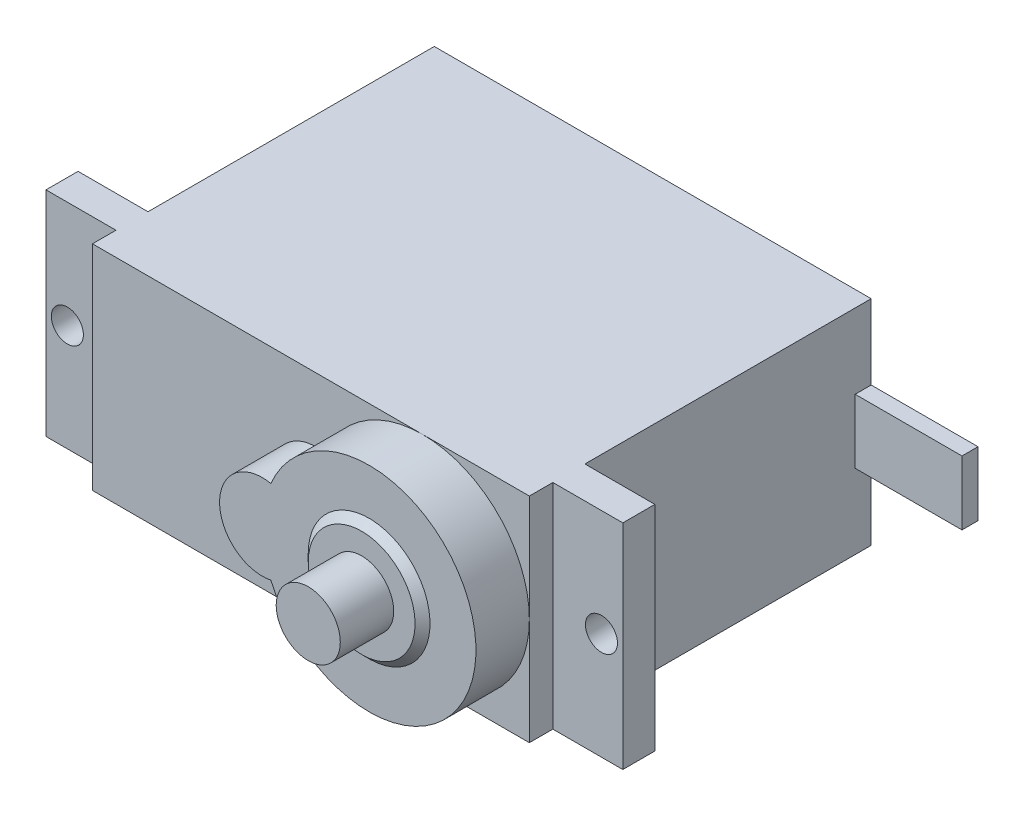
ISO-10303-21;
HEADER;
FILE_DESCRIPTION(('STEP AP214'),'2;1');
FILE_NAME('part.step','',(''),(''),'','','');
FILE_SCHEMA(('AUTOMOTIVE_DESIGN { 1 0 10303 214 1 1 1 1 }'));
ENDSEC;
DATA;
#1=APPLICATION_CONTEXT('core data for automotive mechanical design processes');
#2=APPLICATION_PROTOCOL_DEFINITION('international standard','automotive_design',2000,#1);
#3=PRODUCT_CONTEXT('',#1,'mechanical');
#4=PRODUCT('Part','Part','',(#3));
#5=PRODUCT_RELATED_PRODUCT_CATEGORY('part','',(#4));
#6=PRODUCT_DEFINITION_FORMATION('','',#4);
#7=PRODUCT_DEFINITION_CONTEXT('part definition',#1,'design');
#8=PRODUCT_DEFINITION('design','',#6,#7);
#9=PRODUCT_DEFINITION_SHAPE('','',#8);
#10=(LENGTH_UNIT() NAMED_UNIT(*) SI_UNIT(.MILLI.,.METRE.));
#11=(NAMED_UNIT(*) PLANE_ANGLE_UNIT() SI_UNIT($,.RADIAN.));
#12=(NAMED_UNIT(*) SI_UNIT($,.STERADIAN.) SOLID_ANGLE_UNIT());
#13=UNCERTAINTY_MEASURE_WITH_UNIT(LENGTH_MEASURE(1.E-05),#10,'distance_accuracy_value','');
#14=(GEOMETRIC_REPRESENTATION_CONTEXT(3) GLOBAL_UNCERTAINTY_ASSIGNED_CONTEXT((#13)) GLOBAL_UNIT_ASSIGNED_CONTEXT((#10,
#11,#12)) REPRESENTATION_CONTEXT('',''));
#15=CARTESIAN_POINT('',(0.,0.,0.));
#16=DIRECTION('',(0.,0.,1.));
#17=DIRECTION('',(1.,0.,0.));
#18=AXIS2_PLACEMENT_3D('',#15,#16,#17);
#19=CARTESIAN_POINT('',(10.,10.,-40.2));
#20=DIRECTION('',(-1.,0.,0.));
#21=DIRECTION('',(0.,0.,1.));
#22=AXIS2_PLACEMENT_3D('',#19,#20,#21);
#23=PLANE('',#22);
#24=DIRECTION('',(0.,0.,-1.));
#25=VECTOR('',#24,1.);
#26=CARTESIAN_POINT('',(10.,-3.,-38.7));
#27=LINE('',#26,#25);
#28=CARTESIAN_POINT('',(10.,-3.,-38.7));
#29=VERTEX_POINT('',#28);
#30=CARTESIAN_POINT('',(10.,-3.,-40.2));
#31=VERTEX_POINT('',#30);
#32=EDGE_CURVE('E396',#29,#31,#27,.T.);
#33=ORIENTED_EDGE('',*,*,#32,.F.);
#34=DIRECTION('',(0.,-1.,0.));
#35=VECTOR('',#34,1.);
#36=CARTESIAN_POINT('',(10.,3.,-38.7));
#37=LINE('',#36,#35);
#38=CARTESIAN_POINT('',(10.,3.,-38.7));
#39=VERTEX_POINT('',#38);
#40=EDGE_CURVE('E188',#39,#29,#37,.T.);
#41=ORIENTED_EDGE('',*,*,#40,.F.);
#42=DIRECTION('',(0.,0.,1.));
#43=VECTOR('',#42,1.);
#44=CARTESIAN_POINT('',(10.,3.,-38.7));
#45=LINE('',#44,#43);
#46=CARTESIAN_POINT('',(10.,3.,-40.2));
#47=VERTEX_POINT('',#46);
#48=EDGE_CURVE('E184',#47,#39,#45,.T.);
#49=ORIENTED_EDGE('',*,*,#48,.F.);
#50=DIRECTION('',(0.,-1.,0.));
#51=VECTOR('',#50,1.);
#52=CARTESIAN_POINT('',(10.,10.,-40.2));
#53=LINE('',#52,#51);
#54=CARTESIAN_POINT('',(10.,10.,-40.2));
#55=VERTEX_POINT('',#54);
#56=EDGE_CURVE('E248',#55,#47,#53,.T.);
#57=ORIENTED_EDGE('',*,*,#56,.F.);
#58=DIRECTION('',(0.,0.,1.));
#59=VECTOR('',#58,1.);
#60=CARTESIAN_POINT('',(10.,10.,-40.2));
#61=LINE('',#60,#59);
#62=CARTESIAN_POINT('',(10.,10.,-13.4));
#63=VERTEX_POINT('',#62);
#64=EDGE_CURVE('E273',#55,#63,#61,.T.);
#65=ORIENTED_EDGE('',*,*,#64,.T.);
#66=DIRECTION('',(0.,1.,0.));
#67=VECTOR('',#66,1.);
#68=CARTESIAN_POINT('',(10.,10.,-13.4));
#69=LINE('',#68,#67);
#70=CARTESIAN_POINT('',(10.,-10.,-13.4));
#71=VERTEX_POINT('',#70);
#72=EDGE_CURVE('E236',#71,#63,#69,.T.);
#73=ORIENTED_EDGE('',*,*,#72,.F.);
#74=DIRECTION('',(0.,0.,1.));
#75=VECTOR('',#74,1.);
#76=CARTESIAN_POINT('',(10.,-10.,-40.2));
#77=LINE('',#76,#75);
#78=CARTESIAN_POINT('',(10.,-10.,-40.2));
#79=VERTEX_POINT('',#78);
#80=EDGE_CURVE('E285',#79,#71,#77,.T.);
#81=ORIENTED_EDGE('',*,*,#80,.F.);
#82=EDGE_CURVE('E252',#31,#79,#53,.T.);
#83=ORIENTED_EDGE('',*,*,#82,.F.);
#84=EDGE_LOOP('',(#33,#41,#49,#57,#65,#73,#81,#83));
#85=FACE_BOUND('',#84,.T.);
#86=ADVANCED_FACE('F34',(#85),#23,.F.);
#87=CARTESIAN_POINT('',(10.,-10.,-40.2));
#88=DIRECTION('',(0.,1.,0.));
#89=DIRECTION('',(0.,0.,1.));
#90=AXIS2_PLACEMENT_3D('',#87,#88,#89);
#91=PLANE('',#90);
#92=DIRECTION('',(0.,0.,1.));
#93=VECTOR('',#92,1.);
#94=CARTESIAN_POINT('',(-37.45,-10.,-40.2));
#95=LINE('',#94,#93);
#96=CARTESIAN_POINT('',(-37.45,-10.,-13.4));
#97=VERTEX_POINT('',#96);
#98=CARTESIAN_POINT('',(-37.45,-10.,-10.4));
#99=VERTEX_POINT('',#98);
#100=EDGE_CURVE('E209',#97,#99,#95,.T.);
#101=ORIENTED_EDGE('',*,*,#100,.F.);
#102=DIRECTION('',(1.,0.,0.));
#103=VECTOR('',#102,1.);
#104=CARTESIAN_POINT('',(-50.9,-10.,-13.4));
#105=LINE('',#104,#103);
#106=CARTESIAN_POINT('',(-30.9,-10.,-13.4));
#107=VERTEX_POINT('',#106);
#108=EDGE_CURVE('E227',#97,#107,#105,.T.);
#109=ORIENTED_EDGE('',*,*,#108,.T.);
#110=DIRECTION('',(0.,0.,1.));
#111=VECTOR('',#110,1.);
#112=CARTESIAN_POINT('',(-30.9,-10.,-40.2));
#113=LINE('',#112,#111);
#114=CARTESIAN_POINT('',(-30.9,-10.,-40.2));
#115=VERTEX_POINT('',#114);
#116=EDGE_CURVE('E281',#115,#107,#113,.T.);
#117=ORIENTED_EDGE('',*,*,#116,.F.);
#118=DIRECTION('',(-1.,0.,0.));
#119=VECTOR('',#118,1.);
#120=CARTESIAN_POINT('',(10.,-10.,-40.2));
#121=LINE('',#120,#119);
#122=EDGE_CURVE('E251',#79,#115,#121,.T.);
#123=ORIENTED_EDGE('',*,*,#122,.F.);
#124=ORIENTED_EDGE('',*,*,#80,.T.);
#125=DIRECTION('',(-1.,0.,0.));
#126=VECTOR('',#125,1.);
#127=CARTESIAN_POINT('',(30.,-10.,-13.4));
#128=LINE('',#127,#126);
#129=CARTESIAN_POINT('',(16.55,-10.,-13.4));
#130=VERTEX_POINT('',#129);
#131=EDGE_CURVE('E243',#130,#71,#128,.T.);
#132=ORIENTED_EDGE('',*,*,#131,.F.);
#133=DIRECTION('',(0.,0.,-1.));
#134=VECTOR('',#133,1.);
#135=CARTESIAN_POINT('',(16.55,-10.,-40.2));
#136=LINE('',#135,#134);
#137=CARTESIAN_POINT('',(16.55,-10.,-10.4));
#138=VERTEX_POINT('',#137);
#139=EDGE_CURVE('E57',#138,#130,#136,.T.);
#140=ORIENTED_EDGE('',*,*,#139,.F.);
#141=DIRECTION('',(-1.,0.,0.));
#142=VECTOR('',#141,1.);
#143=CARTESIAN_POINT('',(30.,-10.,-10.4));
#144=LINE('',#143,#142);
#145=CARTESIAN_POINT('',(10.,-10.,-10.4));
#146=VERTEX_POINT('',#145);
#147=EDGE_CURVE('E245',#138,#146,#144,.T.);
#148=ORIENTED_EDGE('',*,*,#147,.T.);
#149=CARTESIAN_POINT('',(10.,-10.,-8.2));
#150=VERTEX_POINT('',#149);
#151=EDGE_CURVE('E284',#146,#150,#77,.T.);
#152=ORIENTED_EDGE('',*,*,#151,.T.);
#153=DIRECTION('',(-1.,0.,0.));
#154=VECTOR('',#153,1.);
#155=CARTESIAN_POINT('',(10.,-10.,-8.2));
#156=LINE('',#155,#154);
#157=CARTESIAN_POINT('',(0.,-10.,-8.2));
#158=VERTEX_POINT('',#157);
#159=EDGE_CURVE('E263',#150,#158,#156,.T.);
#160=ORIENTED_EDGE('',*,*,#159,.T.);
#161=CARTESIAN_POINT('',(-30.9,-10.,-8.2));
#162=VERTEX_POINT('',#161);
#163=EDGE_CURVE('E262',#158,#162,#156,.T.);
#164=ORIENTED_EDGE('',*,*,#163,.T.);
#165=CARTESIAN_POINT('',(-30.9,-10.,-10.4));
#166=VERTEX_POINT('',#165);
#167=EDGE_CURVE('E280',#166,#162,#113,.T.);
#168=ORIENTED_EDGE('',*,*,#167,.F.);
#169=DIRECTION('',(1.,0.,0.));
#170=VECTOR('',#169,1.);
#171=CARTESIAN_POINT('',(-50.9,-10.,-10.4));
#172=LINE('',#171,#170);
#173=EDGE_CURVE('E225',#99,#166,#172,.T.);
#174=ORIENTED_EDGE('',*,*,#173,.F.);
#175=EDGE_LOOP('',(#101,#109,#117,#123,#124,#132,#140,#148,#152,#160,#164,#168,#174));
#176=FACE_BOUND('',#175,.T.);
#177=ADVANCED_FACE('F375',(#176),#91,.F.);
#178=CARTESIAN_POINT('',(10.,10.,-40.2));
#179=DIRECTION('',(0.,-1.,0.));
#180=DIRECTION('',(0.,0.,-1.));
#181=AXIS2_PLACEMENT_3D('',#178,#179,#180);
#182=PLANE('',#181);
#183=DIRECTION('',(0.,0.,-1.));
#184=VECTOR('',#183,1.);
#185=CARTESIAN_POINT('',(-37.45,10.,-40.2));
#186=LINE('',#185,#184);
#187=CARTESIAN_POINT('',(-37.45,10.,-10.4));
#188=VERTEX_POINT('',#187);
#189=CARTESIAN_POINT('',(-37.45,10.,-13.4));
#190=VERTEX_POINT('',#189);
#191=EDGE_CURVE('E205',#188,#190,#186,.T.);
#192=ORIENTED_EDGE('',*,*,#191,.F.);
#193=DIRECTION('',(1.,0.,0.));
#194=VECTOR('',#193,1.);
#195=CARTESIAN_POINT('',(-50.9,10.,-10.4));
#196=LINE('',#195,#194);
#197=CARTESIAN_POINT('',(-30.9,10.,-10.4));
#198=VERTEX_POINT('',#197);
#199=EDGE_CURVE('E231',#188,#198,#196,.T.);
#200=ORIENTED_EDGE('',*,*,#199,.T.);
#201=DIRECTION('',(0.,0.,1.));
#202=VECTOR('',#201,1.);
#203=CARTESIAN_POINT('',(-30.9,10.,-40.2));
#204=LINE('',#203,#202);
#205=CARTESIAN_POINT('',(-30.9,10.,-8.2));
#206=VERTEX_POINT('',#205);
#207=EDGE_CURVE('E276',#198,#206,#204,.T.);
#208=ORIENTED_EDGE('',*,*,#207,.T.);
#209=DIRECTION('',(1.,0.,0.));
#210=VECTOR('',#209,1.);
#211=CARTESIAN_POINT('',(10.,10.,-8.2));
#212=LINE('',#211,#210);
#213=CARTESIAN_POINT('',(0.,10.,-8.2));
#214=VERTEX_POINT('',#213);
#215=EDGE_CURVE('E270',#206,#214,#212,.T.);
#216=ORIENTED_EDGE('',*,*,#215,.T.);
#217=CARTESIAN_POINT('',(10.,10.,-8.2));
#218=VERTEX_POINT('',#217);
#219=EDGE_CURVE('E269',#214,#218,#212,.T.);
#220=ORIENTED_EDGE('',*,*,#219,.T.);
#221=CARTESIAN_POINT('',(10.,10.,-10.4));
#222=VERTEX_POINT('',#221);
#223=EDGE_CURVE('E258',#222,#218,#61,.T.);
#224=ORIENTED_EDGE('',*,*,#223,.F.);
#225=DIRECTION('',(-1.,0.,0.));
#226=VECTOR('',#225,1.);
#227=CARTESIAN_POINT('',(30.,10.,-10.4));
#228=LINE('',#227,#226);
#229=CARTESIAN_POINT('',(16.55,10.,-10.4));
#230=VERTEX_POINT('',#229);
#231=EDGE_CURVE('E239',#230,#222,#228,.T.);
#232=ORIENTED_EDGE('',*,*,#231,.F.);
#233=DIRECTION('',(0.,0.,1.));
#234=VECTOR('',#233,1.);
#235=CARTESIAN_POINT('',(16.55,10.,-40.2));
#236=LINE('',#235,#234);
#237=CARTESIAN_POINT('',(16.55,10.,-13.4));
#238=VERTEX_POINT('',#237);
#239=EDGE_CURVE('E214',#238,#230,#236,.T.);
#240=ORIENTED_EDGE('',*,*,#239,.F.);
#241=DIRECTION('',(-1.,0.,0.));
#242=VECTOR('',#241,1.);
#243=CARTESIAN_POINT('',(30.,10.,-13.4));
#244=LINE('',#243,#242);
#245=EDGE_CURVE('E241',#238,#63,#244,.T.);
#246=ORIENTED_EDGE('',*,*,#245,.T.);
#247=ORIENTED_EDGE('',*,*,#64,.F.);
#248=DIRECTION('',(1.,0.,0.));
#249=VECTOR('',#248,1.);
#250=CARTESIAN_POINT('',(10.,10.,-40.2));
#251=LINE('',#250,#249);
#252=CARTESIAN_POINT('',(-30.9,10.,-40.2));
#253=VERTEX_POINT('',#252);
#254=EDGE_CURVE('E256',#253,#55,#251,.T.);
#255=ORIENTED_EDGE('',*,*,#254,.F.);
#256=CARTESIAN_POINT('',(-30.9,10.,-13.4));
#257=VERTEX_POINT('',#256);
#258=EDGE_CURVE('E277',#253,#257,#204,.T.);
#259=ORIENTED_EDGE('',*,*,#258,.T.);
#260=DIRECTION('',(1.,0.,0.));
#261=VECTOR('',#260,1.);
#262=CARTESIAN_POINT('',(-50.9,10.,-13.4));
#263=LINE('',#262,#261);
#264=EDGE_CURVE('E229',#190,#257,#263,.T.);
#265=ORIENTED_EDGE('',*,*,#264,.F.);
#266=EDGE_LOOP('',(#192,#200,#208,#216,#220,#224,#232,#240,#246,#247,#255,#259,#265));
#267=FACE_BOUND('',#266,.T.);
#268=ADVANCED_FACE('F365',(#267),#182,.F.);
#269=CARTESIAN_POINT('',(30.,10.,-10.4));
#270=DIRECTION('',(0.,0.,-1.));
#271=DIRECTION('',(0.,1.,0.));
#272=AXIS2_PLACEMENT_3D('',#269,#270,#271);
#273=PLANE('',#272);
#274=CARTESIAN_POINT('',(14.55,0.,-10.4));
#275=DIRECTION('',(0.,0.,1.));
#276=DIRECTION('',(-1.,0.,0.));
#277=AXIS2_PLACEMENT_3D('',#274,#275,#276);
#278=CIRCLE('',#277,1.5);
#279=CARTESIAN_POINT('',(13.05,0.,-10.4));
#280=VERTEX_POINT('',#279);
#281=EDGE_CURVE('E190',#280,#280,#278,.T.);
#282=ORIENTED_EDGE('',*,*,#281,.F.);
#283=EDGE_LOOP('',(#282));
#284=FACE_BOUND('',#283,.T.);
#285=DIRECTION('',(0.,-1.,0.));
#286=VECTOR('',#285,1.);
#287=CARTESIAN_POINT('',(16.55,10.,-10.4));
#288=LINE('',#287,#286);
#289=EDGE_CURVE('E217',#230,#138,#288,.T.);
#290=ORIENTED_EDGE('',*,*,#289,.F.);
#291=ORIENTED_EDGE('',*,*,#231,.T.);
#292=DIRECTION('',(0.,-1.,0.));
#293=VECTOR('',#292,1.);
#294=CARTESIAN_POINT('',(10.,10.,-10.4));
#295=LINE('',#294,#293);
#296=EDGE_CURVE('E233',#222,#146,#295,.T.);
#297=ORIENTED_EDGE('',*,*,#296,.T.);
#298=ORIENTED_EDGE('',*,*,#147,.F.);
#299=EDGE_LOOP('',(#290,#291,#297,#298));
#300=FACE_BOUND('',#299,.T.);
#301=ADVANCED_FACE('F379',(#284,#300),#273,.F.);
#302=CARTESIAN_POINT('',(30.,10.,-13.4));
#303=DIRECTION('',(0.,0.,1.));
#304=DIRECTION('',(0.,-1.,0.));
#305=AXIS2_PLACEMENT_3D('',#302,#303,#304);
#306=PLANE('',#305);
#307=CARTESIAN_POINT('',(14.55,0.,-13.4));
#308=DIRECTION('',(0.,0.,1.));
#309=DIRECTION('',(0.,-1.,0.));
#310=AXIS2_PLACEMENT_3D('',#307,#308,#309);
#311=CIRCLE('',#310,1.5);
#312=CARTESIAN_POINT('',(14.55,-1.5,-13.4));
#313=VERTEX_POINT('',#312);
#314=EDGE_CURVE('E193',#313,#313,#311,.F.);
#315=ORIENTED_EDGE('',*,*,#314,.F.);
#316=EDGE_LOOP('',(#315));
#317=FACE_BOUND('',#316,.T.);
#318=DIRECTION('',(0.,1.,0.));
#319=VECTOR('',#318,1.);
#320=CARTESIAN_POINT('',(16.55,10.,-13.4));
#321=LINE('',#320,#319);
#322=EDGE_CURVE('E316',#130,#238,#321,.T.);
#323=ORIENTED_EDGE('',*,*,#322,.F.);
#324=ORIENTED_EDGE('',*,*,#131,.T.);
#325=ORIENTED_EDGE('',*,*,#72,.T.);
#326=ORIENTED_EDGE('',*,*,#245,.F.);
#327=EDGE_LOOP('',(#323,#324,#325,#326));
#328=FACE_BOUND('',#327,.T.);
#329=ADVANCED_FACE('F384',(#317,#328),#306,.F.);
#330=CARTESIAN_POINT('',(-50.9,10.,-10.4));
#331=DIRECTION('',(0.,0.,1.));
#332=DIRECTION('',(0.,-1.,0.));
#333=AXIS2_PLACEMENT_3D('',#330,#331,#332);
#334=PLANE('',#333);
#335=CARTESIAN_POINT('',(-35.45,0.,-10.4));
#336=DIRECTION('',(0.,0.,1.));
#337=DIRECTION('',(1.,0.,0.));
#338=AXIS2_PLACEMENT_3D('',#335,#336,#337);
#339=CIRCLE('',#338,1.5);
#340=CARTESIAN_POINT('',(-33.95,0.,-10.4));
#341=VERTEX_POINT('',#340);
#342=EDGE_CURVE('E202',#341,#341,#339,.T.);
#343=ORIENTED_EDGE('',*,*,#342,.F.);
#344=EDGE_LOOP('',(#343));
#345=FACE_BOUND('',#344,.T.);
#346=ORIENTED_EDGE('',*,*,#199,.F.);
#347=DIRECTION('',(0.,-1.,0.));
#348=VECTOR('',#347,1.);
#349=CARTESIAN_POINT('',(-37.45,10.,-10.4));
#350=LINE('',#349,#348);
#351=EDGE_CURVE('E211',#188,#99,#350,.T.);
#352=ORIENTED_EDGE('',*,*,#351,.T.);
#353=ORIENTED_EDGE('',*,*,#173,.T.);
#354=DIRECTION('',(0.,-1.,0.));
#355=VECTOR('',#354,1.);
#356=CARTESIAN_POINT('',(-30.9,10.,-10.4));
#357=LINE('',#356,#355);
#358=EDGE_CURVE('E219',#198,#166,#357,.T.);
#359=ORIENTED_EDGE('',*,*,#358,.F.);
#360=EDGE_LOOP('',(#346,#352,#353,#359));
#361=FACE_BOUND('',#360,.T.);
#362=ADVANCED_FACE('F419',(#345,#361),#334,.T.);
#363=CARTESIAN_POINT('',(-50.9,10.,-13.4));
#364=DIRECTION('',(0.,0.,-1.));
#365=DIRECTION('',(0.,1.,0.));
#366=AXIS2_PLACEMENT_3D('',#363,#364,#365);
#367=PLANE('',#366);
#368=CARTESIAN_POINT('',(-35.45,0.,-13.4));
#369=DIRECTION('',(0.,0.,-1.));
#370=DIRECTION('',(0.,1.,0.));
#371=AXIS2_PLACEMENT_3D('',#368,#369,#370);
#372=CIRCLE('',#371,1.5);
#373=CARTESIAN_POINT('',(-35.45,1.5,-13.4));
#374=VERTEX_POINT('',#373);
#375=EDGE_CURVE('E201',#374,#374,#372,.F.);
#376=ORIENTED_EDGE('',*,*,#375,.T.);
#377=EDGE_LOOP('',(#376));
#378=FACE_BOUND('',#377,.T.);
#379=ORIENTED_EDGE('',*,*,#108,.F.);
#380=DIRECTION('',(0.,1.,0.));
#381=VECTOR('',#380,1.);
#382=CARTESIAN_POINT('',(-37.45,10.,-13.4));
#383=LINE('',#382,#381);
#384=EDGE_CURVE('E313',#97,#190,#383,.T.);
#385=ORIENTED_EDGE('',*,*,#384,.T.);
#386=ORIENTED_EDGE('',*,*,#264,.T.);
#387=DIRECTION('',(0.,1.,0.));
#388=VECTOR('',#387,1.);
#389=CARTESIAN_POINT('',(-30.9,10.,-13.4));
#390=LINE('',#389,#388);
#391=EDGE_CURVE('E222',#107,#257,#390,.T.);
#392=ORIENTED_EDGE('',*,*,#391,.F.);
#393=EDGE_LOOP('',(#379,#385,#386,#392));
#394=FACE_BOUND('',#393,.T.);
#395=ADVANCED_FACE('F414',(#378,#394),#367,.T.);
#396=CARTESIAN_POINT('',(-30.9,10.,-40.2));
#397=DIRECTION('',(1.,0.,0.));
#398=DIRECTION('',(0.,0.,-1.));
#399=AXIS2_PLACEMENT_3D('',#396,#397,#398);
#400=PLANE('',#399);
#401=ORIENTED_EDGE('',*,*,#207,.F.);
#402=ORIENTED_EDGE('',*,*,#358,.T.);
#403=ORIENTED_EDGE('',*,*,#167,.T.);
#404=DIRECTION('',(0.,1.,0.));
#405=VECTOR('',#404,1.);
#406=CARTESIAN_POINT('',(-30.9,10.,-8.2));
#407=LINE('',#406,#405);
#408=EDGE_CURVE('E266',#162,#206,#407,.T.);
#409=ORIENTED_EDGE('',*,*,#408,.T.);
#410=EDGE_LOOP('',(#401,#402,#403,#409));
#411=FACE_BOUND('',#410,.T.);
#412=ADVANCED_FACE('F369',(#411),#400,.F.);
#413=ORIENTED_EDGE('',*,*,#296,.F.);
#414=ORIENTED_EDGE('',*,*,#223,.T.);
#415=DIRECTION('',(0.,-1.,0.));
#416=VECTOR('',#415,1.);
#417=CARTESIAN_POINT('',(10.,10.,-8.2));
#418=LINE('',#417,#416);
#419=CARTESIAN_POINT('',(10.,0.,-8.2));
#420=VERTEX_POINT('',#419);
#421=EDGE_CURVE('E259',#218,#420,#418,.T.);
#422=ORIENTED_EDGE('',*,*,#421,.T.);
#423=EDGE_CURVE('E247',#420,#150,#418,.T.);
#424=ORIENTED_EDGE('',*,*,#423,.T.);
#425=ORIENTED_EDGE('',*,*,#151,.F.);
#426=EDGE_LOOP('',(#413,#414,#422,#424,#425));
#427=FACE_BOUND('',#426,.T.);
#428=ADVANCED_FACE('F360',(#427),#23,.F.);
#429=CARTESIAN_POINT('',(0.,0.,2.5));
#430=DIRECTION('',(0.,0.,-1.));
#431=DIRECTION('',(-1.,0.,0.));
#432=AXIS2_PLACEMENT_3D('',#429,#430,#431);
#433=CYLINDRICAL_SURFACE('',#432,3.);
#434=CARTESIAN_POINT('',(0.,0.,2.5));
#435=DIRECTION('',(0.,0.,1.));
#436=DIRECTION('',(1.,0.,0.));
#437=AXIS2_PLACEMENT_3D('',#434,#435,#436);
#438=CIRCLE('',#437,3.);
#439=CARTESIAN_POINT('',(3.,0.,2.5));
#440=VERTEX_POINT('',#439);
#441=EDGE_CURVE('E310',#440,#440,#438,.T.);
#442=ORIENTED_EDGE('',*,*,#441,.F.);
#443=EDGE_LOOP('',(#442));
#444=FACE_BOUND('',#443,.T.);
#445=CARTESIAN_POINT('',(0.,0.,-2.5));
#446=DIRECTION('',(0.,0.,-1.));
#447=DIRECTION('',(-1.,0.,0.));
#448=AXIS2_PLACEMENT_3D('',#445,#446,#447);
#449=CIRCLE('',#448,3.);
#450=CARTESIAN_POINT('',(-3.,0.,-2.5));
#451=VERTEX_POINT('',#450);
#452=EDGE_CURVE('E307',#451,#451,#449,.T.);
#453=ORIENTED_EDGE('',*,*,#452,.F.);
#454=EDGE_LOOP('',(#453));
#455=FACE_BOUND('',#454,.T.);
#456=ADVANCED_FACE('F439',(#444,#455),#433,.T.);
#457=CARTESIAN_POINT('',(0.,0.,2.5));
#458=DIRECTION('',(0.,0.,1.));
#459=DIRECTION('',(1.,0.,0.));
#460=AXIS2_PLACEMENT_3D('',#457,#458,#459);
#461=PLANE('',#460);
#462=ORIENTED_EDGE('',*,*,#441,.T.);
#463=EDGE_LOOP('',(#462));
#464=FACE_BOUND('',#463,.T.);
#465=ADVANCED_FACE('F444',(#464),#461,.T.);
#466=CARTESIAN_POINT('',(0.,0.,-2.5));
#467=DIRECTION('',(0.,0.,-1.));
#468=DIRECTION('',(-1.,0.,0.));
#469=AXIS2_PLACEMENT_3D('',#466,#467,#468);
#470=PLANE('',#469);
#471=CARTESIAN_POINT('',(0.,0.,-2.5));
#472=DIRECTION('',(0.,0.,-1.));
#473=DIRECTION('',(-1.,0.,0.));
#474=AXIS2_PLACEMENT_3D('',#471,#472,#473);
#475=CIRCLE('',#474,4.99999999999999);
#476=CARTESIAN_POINT('',(-4.99999999999999,0.,-2.5));
#477=VERTEX_POINT('',#476);
#478=EDGE_CURVE('E42',#477,#477,#475,.F.);
#479=ORIENTED_EDGE('',*,*,#478,.T.);
#480=EDGE_LOOP('',(#479));
#481=FACE_BOUND('',#480,.T.);
#482=ORIENTED_EDGE('',*,*,#452,.T.);
#483=EDGE_LOOP('',(#482));
#484=FACE_BOUND('',#483,.T.);
#485=ADVANCED_FACE('F320',(#481,#484),#470,.F.);
#486=CARTESIAN_POINT('',(-10.,0.,-8.2));
#487=DIRECTION('',(0.,0.,1.));
#488=DIRECTION('',(1.,0.,0.));
#489=AXIS2_PLACEMENT_3D('',#486,#487,#488);
#490=CYLINDRICAL_SURFACE('',#489,4.);
#491=CARTESIAN_POINT('',(-10.,0.,-3.2));
#492=DIRECTION('',(0.,0.,-1.));
#493=DIRECTION('',(-1.,0.,0.));
#494=AXIS2_PLACEMENT_3D('',#491,#492,#493);
#495=CIRCLE('',#494,4.);
#496=CARTESIAN_POINT('',(-9.2,-3.91918358845309,-3.2));
#497=VERTEX_POINT('',#496);
#498=CARTESIAN_POINT('',(-9.2,3.91918358845309,-3.2));
#499=VERTEX_POINT('',#498);
#500=EDGE_CURVE('E288',#497,#499,#495,.T.);
#501=ORIENTED_EDGE('',*,*,#500,.T.);
#502=DIRECTION('',(0.,0.,1.));
#503=VECTOR('',#502,1.);
#504=CARTESIAN_POINT('',(-9.2,3.91918358845309,-8.2));
#505=LINE('',#504,#503);
#506=CARTESIAN_POINT('',(-9.2,3.91918358845309,-8.2));
#507=VERTEX_POINT('',#506);
#508=EDGE_CURVE('E304',#507,#499,#505,.T.);
#509=ORIENTED_EDGE('',*,*,#508,.F.);
#510=CARTESIAN_POINT('',(-10.,0.,-8.2));
#511=DIRECTION('',(0.,0.,-1.));
#512=DIRECTION('',(-1.,0.,0.));
#513=AXIS2_PLACEMENT_3D('',#510,#511,#512);
#514=CIRCLE('',#513,4.);
#515=CARTESIAN_POINT('',(-9.2,-3.91918358845309,-8.2));
#516=VERTEX_POINT('',#515);
#517=EDGE_CURVE('E289',#516,#507,#514,.T.);
#518=ORIENTED_EDGE('',*,*,#517,.F.);
#519=DIRECTION('',(0.,0.,1.));
#520=VECTOR('',#519,1.);
#521=CARTESIAN_POINT('',(-9.2,-3.91918358845309,-8.2));
#522=LINE('',#521,#520);
#523=EDGE_CURVE('E297',#516,#497,#522,.T.);
#524=ORIENTED_EDGE('',*,*,#523,.T.);
#525=EDGE_LOOP('',(#501,#509,#518,#524));
#526=FACE_BOUND('',#525,.T.);
#527=ADVANCED_FACE('F336',(#526),#490,.T.);
#528=CARTESIAN_POINT('',(0.,0.,-8.2));
#529=DIRECTION('',(0.,0.,1.));
#530=DIRECTION('',(1.,0.,0.));
#531=AXIS2_PLACEMENT_3D('',#528,#529,#530);
#532=CYLINDRICAL_SURFACE('',#531,10.);
#533=CARTESIAN_POINT('',(0.,0.,-3.2));
#534=DIRECTION('',(0.,0.,-1.));
#535=DIRECTION('',(-1.,0.,0.));
#536=AXIS2_PLACEMENT_3D('',#533,#534,#535);
#537=CIRCLE('',#536,10.);
#538=EDGE_CURVE('E293',#499,#497,#537,.T.);
#539=ORIENTED_EDGE('',*,*,#538,.T.);
#540=ORIENTED_EDGE('',*,*,#523,.F.);
#541=CARTESIAN_POINT('',(0.,0.,-8.2));
#542=DIRECTION('',(0.,0.,-1.));
#543=DIRECTION('',(-1.,0.,0.));
#544=AXIS2_PLACEMENT_3D('',#541,#542,#543);
#545=CIRCLE('',#544,10.);
#546=EDGE_CURVE('E292',#158,#516,#545,.T.);
#547=ORIENTED_EDGE('',*,*,#546,.F.);
#548=EDGE_CURVE('E345',#420,#158,#545,.T.);
#549=ORIENTED_EDGE('',*,*,#548,.F.);
#550=EDGE_CURVE('E298',#214,#420,#545,.T.);
#551=ORIENTED_EDGE('',*,*,#550,.F.);
#552=EDGE_CURVE('E294',#507,#214,#545,.T.);
#553=ORIENTED_EDGE('',*,*,#552,.F.);
#554=ORIENTED_EDGE('',*,*,#508,.T.);
#555=EDGE_LOOP('',(#539,#540,#547,#549,#551,#553,#554));
#556=FACE_BOUND('',#555,.T.);
#557=ADVANCED_FACE('F331',(#556),#532,.T.);
#558=CARTESIAN_POINT('',(-5.,0.,-3.2));
#559=DIRECTION('',(0.,0.,-1.));
#560=DIRECTION('',(-1.,0.,0.));
#561=AXIS2_PLACEMENT_3D('',#558,#559,#560);
#562=PLANE('',#561);
#563=CARTESIAN_POINT('',(0.,0.,-3.2));
#564=DIRECTION('',(0.,0.,-1.));
#565=DIRECTION('',(-1.,0.,0.));
#566=AXIS2_PLACEMENT_3D('',#563,#564,#565);
#567=CIRCLE('',#566,5.69999999999999);
#568=CARTESIAN_POINT('',(-5.69999999999999,0.,-3.2));
#569=VERTEX_POINT('',#568);
#570=EDGE_CURVE('E12',#569,#569,#567,.T.);
#571=ORIENTED_EDGE('',*,*,#570,.T.);
#572=EDGE_LOOP('',(#571));
#573=FACE_BOUND('',#572,.T.);
#574=ORIENTED_EDGE('',*,*,#500,.F.);
#575=ORIENTED_EDGE('',*,*,#538,.F.);
#576=EDGE_LOOP('',(#574,#575));
#577=FACE_BOUND('',#576,.T.);
#578=ADVANCED_FACE('F327',(#573,#577),#562,.F.);
#579=CARTESIAN_POINT('',(0.,0.,-8.2));
#580=DIRECTION('',(0.,0.,-1.));
#581=DIRECTION('',(-1.,0.,0.));
#582=AXIS2_PLACEMENT_3D('',#579,#580,#581);
#583=PLANE('',#582);
#584=ORIENTED_EDGE('',*,*,#546,.T.);
#585=ORIENTED_EDGE('',*,*,#517,.T.);
#586=ORIENTED_EDGE('',*,*,#552,.T.);
#587=ORIENTED_EDGE('',*,*,#215,.F.);
#588=ORIENTED_EDGE('',*,*,#408,.F.);
#589=ORIENTED_EDGE('',*,*,#163,.F.);
#590=EDGE_LOOP('',(#584,#585,#586,#587,#588,#589));
#591=FACE_BOUND('',#590,.T.);
#592=ADVANCED_FACE('F330',(#591),#583,.F.);
#593=ORIENTED_EDGE('',*,*,#219,.F.);
#594=ORIENTED_EDGE('',*,*,#550,.T.);
#595=ORIENTED_EDGE('',*,*,#421,.F.);
#596=EDGE_LOOP('',(#593,#594,#595));
#597=FACE_BOUND('',#596,.T.);
#598=ADVANCED_FACE('F353',(#597),#583,.F.);
#599=ORIENTED_EDGE('',*,*,#423,.F.);
#600=ORIENTED_EDGE('',*,*,#548,.T.);
#601=ORIENTED_EDGE('',*,*,#159,.F.);
#602=EDGE_LOOP('',(#599,#600,#601));
#603=FACE_BOUND('',#602,.T.);
#604=ADVANCED_FACE('F356',(#603),#583,.F.);
#605=ORIENTED_EDGE('',*,*,#116,.T.);
#606=ORIENTED_EDGE('',*,*,#391,.T.);
#607=ORIENTED_EDGE('',*,*,#258,.F.);
#608=DIRECTION('',(0.,1.,0.));
#609=VECTOR('',#608,1.);
#610=CARTESIAN_POINT('',(-30.9,10.,-40.2));
#611=LINE('',#610,#609);
#612=EDGE_CURVE('E254',#115,#253,#611,.T.);
#613=ORIENTED_EDGE('',*,*,#612,.F.);
#614=EDGE_LOOP('',(#605,#606,#607,#613));
#615=FACE_BOUND('',#614,.T.);
#616=ADVANCED_FACE('F410',(#615),#400,.F.);
#617=CARTESIAN_POINT('',(0.,0.,-40.2));
#618=DIRECTION('',(0.,0.,-1.));
#619=DIRECTION('',(-1.,0.,0.));
#620=AXIS2_PLACEMENT_3D('',#617,#618,#619);
#621=PLANE('',#620);
#622=ORIENTED_EDGE('',*,*,#56,.T.);
#623=DIRECTION('',(-1.,0.,0.));
#624=VECTOR('',#623,1.);
#625=CARTESIAN_POINT('',(20.,3.,-40.2));
#626=LINE('',#625,#624);
#627=CARTESIAN_POINT('',(20.,3.,-40.2));
#628=VERTEX_POINT('',#627);
#629=EDGE_CURVE('E195',#628,#47,#626,.T.);
#630=ORIENTED_EDGE('',*,*,#629,.F.);
#631=DIRECTION('',(0.,1.,0.));
#632=VECTOR('',#631,1.);
#633=CARTESIAN_POINT('',(20.,3.,-40.2));
#634=LINE('',#633,#632);
#635=CARTESIAN_POINT('',(20.,-3.,-40.2));
#636=VERTEX_POINT('',#635);
#637=EDGE_CURVE('E174',#636,#628,#634,.T.);
#638=ORIENTED_EDGE('',*,*,#637,.F.);
#639=DIRECTION('',(-1.,0.,0.));
#640=VECTOR('',#639,1.);
#641=CARTESIAN_POINT('',(20.,-3.,-40.2));
#642=LINE('',#641,#640);
#643=EDGE_CURVE('E49',#636,#31,#642,.T.);
#644=ORIENTED_EDGE('',*,*,#643,.T.);
#645=ORIENTED_EDGE('',*,*,#82,.T.);
#646=ORIENTED_EDGE('',*,*,#122,.T.);
#647=ORIENTED_EDGE('',*,*,#612,.T.);
#648=ORIENTED_EDGE('',*,*,#254,.T.);
#649=EDGE_LOOP('',(#622,#630,#638,#644,#645,#646,#647,#648));
#650=FACE_BOUND('',#649,.T.);
#651=ADVANCED_FACE('F394',(#650),#621,.T.);
#652=CARTESIAN_POINT('',(-37.45,-15.,-40.2));
#653=DIRECTION('',(-1.,0.,0.));
#654=DIRECTION('',(0.,0.,1.));
#655=AXIS2_PLACEMENT_3D('',#652,#653,#654);
#656=PLANE('',#655);
#657=ORIENTED_EDGE('',*,*,#191,.T.);
#658=ORIENTED_EDGE('',*,*,#384,.F.);
#659=ORIENTED_EDGE('',*,*,#100,.T.);
#660=ORIENTED_EDGE('',*,*,#351,.F.);
#661=EDGE_LOOP('',(#657,#658,#659,#660));
#662=FACE_BOUND('',#661,.T.);
#663=ADVANCED_FACE('F416',(#662),#656,.T.);
#664=CARTESIAN_POINT('',(16.55,-15.,-40.2));
#665=DIRECTION('',(1.,0.,0.));
#666=DIRECTION('',(0.,0.,-1.));
#667=AXIS2_PLACEMENT_3D('',#664,#665,#666);
#668=PLANE('',#667);
#669=ORIENTED_EDGE('',*,*,#289,.T.);
#670=ORIENTED_EDGE('',*,*,#139,.T.);
#671=ORIENTED_EDGE('',*,*,#322,.T.);
#672=ORIENTED_EDGE('',*,*,#239,.T.);
#673=EDGE_LOOP('',(#669,#670,#671,#672));
#674=FACE_BOUND('',#673,.T.);
#675=ADVANCED_FACE('F515',(#674),#668,.T.);
#676=CARTESIAN_POINT('',(-35.45,0.,-40.201));
#677=DIRECTION('',(0.,0.,1.));
#678=DIRECTION('',(1.,0.,0.));
#679=AXIS2_PLACEMENT_3D('',#676,#677,#678);
#680=CYLINDRICAL_SURFACE('',#679,1.5);
#681=ORIENTED_EDGE('',*,*,#375,.F.);
#682=EDGE_LOOP('',(#681));
#683=FACE_BOUND('',#682,.T.);
#684=ORIENTED_EDGE('',*,*,#342,.T.);
#685=EDGE_LOOP('',(#684));
#686=FACE_BOUND('',#685,.T.);
#687=ADVANCED_FACE('F524',(#683,#686),#680,.F.);
#688=CARTESIAN_POINT('',(14.55,0.,-40.201));
#689=DIRECTION('',(0.,0.,1.));
#690=DIRECTION('',(1.,0.,0.));
#691=AXIS2_PLACEMENT_3D('',#688,#689,#690);
#692=CYLINDRICAL_SURFACE('',#691,1.5);
#693=ORIENTED_EDGE('',*,*,#281,.T.);
#694=EDGE_LOOP('',(#693));
#695=FACE_BOUND('',#694,.T.);
#696=ORIENTED_EDGE('',*,*,#314,.T.);
#697=EDGE_LOOP('',(#696));
#698=FACE_BOUND('',#697,.T.);
#699=ADVANCED_FACE('F557',(#695,#698),#692,.F.);
#700=CARTESIAN_POINT('',(20.,3.,-38.7));
#701=DIRECTION('',(0.,0.,-1.));
#702=DIRECTION('',(-1.,0.,0.));
#703=AXIS2_PLACEMENT_3D('',#700,#701,#702);
#704=PLANE('',#703);
#705=ORIENTED_EDGE('',*,*,#40,.T.);
#706=DIRECTION('',(-1.,0.,0.));
#707=VECTOR('',#706,1.);
#708=CARTESIAN_POINT('',(20.,-3.,-38.7));
#709=LINE('',#708,#707);
#710=CARTESIAN_POINT('',(20.,-3.,-38.7));
#711=VERTEX_POINT('',#710);
#712=EDGE_CURVE('E171',#711,#29,#709,.T.);
#713=ORIENTED_EDGE('',*,*,#712,.F.);
#714=DIRECTION('',(0.,-1.,0.));
#715=VECTOR('',#714,1.);
#716=CARTESIAN_POINT('',(20.,3.,-38.7));
#717=LINE('',#716,#715);
#718=CARTESIAN_POINT('',(20.,3.,-38.7));
#719=VERTEX_POINT('',#718);
#720=EDGE_CURVE('E175',#719,#711,#717,.T.);
#721=ORIENTED_EDGE('',*,*,#720,.F.);
#722=DIRECTION('',(-1.,0.,0.));
#723=VECTOR('',#722,1.);
#724=CARTESIAN_POINT('',(20.,3.,-38.7));
#725=LINE('',#724,#723);
#726=EDGE_CURVE('E403',#719,#39,#725,.T.);
#727=ORIENTED_EDGE('',*,*,#726,.T.);
#728=EDGE_LOOP('',(#705,#713,#721,#727));
#729=FACE_BOUND('',#728,.T.);
#730=ADVANCED_FACE('F186',(#729),#704,.F.);
#731=CARTESIAN_POINT('',(20.,-3.,-38.7));
#732=DIRECTION('',(0.,1.,0.));
#733=DIRECTION('',(0.,0.,1.));
#734=AXIS2_PLACEMENT_3D('',#731,#732,#733);
#735=PLANE('',#734);
#736=ORIENTED_EDGE('',*,*,#32,.T.);
#737=ORIENTED_EDGE('',*,*,#643,.F.);
#738=DIRECTION('',(0.,0.,-1.));
#739=VECTOR('',#738,1.);
#740=CARTESIAN_POINT('',(20.,-3.,-38.7));
#741=LINE('',#740,#739);
#742=EDGE_CURVE('E167',#711,#636,#741,.T.);
#743=ORIENTED_EDGE('',*,*,#742,.F.);
#744=ORIENTED_EDGE('',*,*,#712,.T.);
#745=EDGE_LOOP('',(#736,#737,#743,#744));
#746=FACE_BOUND('',#745,.T.);
#747=ADVANCED_FACE('F169',(#746),#735,.F.);
#748=CARTESIAN_POINT('',(20.,3.,-38.7));
#749=DIRECTION('',(0.,-1.,0.));
#750=DIRECTION('',(0.,0.,-1.));
#751=AXIS2_PLACEMENT_3D('',#748,#749,#750);
#752=PLANE('',#751);
#753=ORIENTED_EDGE('',*,*,#48,.T.);
#754=ORIENTED_EDGE('',*,*,#726,.F.);
#755=DIRECTION('',(0.,0.,1.));
#756=VECTOR('',#755,1.);
#757=CARTESIAN_POINT('',(20.,3.,-38.7));
#758=LINE('',#757,#756);
#759=EDGE_CURVE('E180',#628,#719,#758,.T.);
#760=ORIENTED_EDGE('',*,*,#759,.F.);
#761=ORIENTED_EDGE('',*,*,#629,.T.);
#762=EDGE_LOOP('',(#753,#754,#760,#761));
#763=FACE_BOUND('',#762,.T.);
#764=ADVANCED_FACE('F406',(#763),#752,.F.);
#765=CARTESIAN_POINT('',(20.,0.,0.));
#766=DIRECTION('',(1.,0.,0.));
#767=DIRECTION('',(0.,0.,-1.));
#768=AXIS2_PLACEMENT_3D('',#765,#766,#767);
#769=PLANE('',#768);
#770=ORIENTED_EDGE('',*,*,#720,.T.);
#771=ORIENTED_EDGE('',*,*,#742,.T.);
#772=ORIENTED_EDGE('',*,*,#637,.T.);
#773=ORIENTED_EDGE('',*,*,#759,.T.);
#774=EDGE_LOOP('',(#770,#771,#772,#773));
#775=FACE_BOUND('',#774,.T.);
#776=ADVANCED_FACE('F178',(#775),#769,.T.);
#777=CARTESIAN_POINT('',(0.,0.,-3.50000000000002));
#778=DIRECTION('',(0.,0.,-1.));
#779=DIRECTION('',(-1.,0.,0.));
#780=AXIS2_PLACEMENT_3D('',#777,#778,#779);
#781=CONICAL_SURFACE('',#780,6.,0.785398163397443);
#782=ORIENTED_EDGE('',*,*,#478,.F.);
#783=EDGE_LOOP('',(#782));
#784=FACE_BOUND('',#783,.T.);
#785=ORIENTED_EDGE('',*,*,#570,.F.);
#786=EDGE_LOOP('',(#785));
#787=FACE_BOUND('',#786,.T.);
#788=ADVANCED_FACE('F36',(#784,#787),#781,.T.);
#789=CLOSED_SHELL('',(#86,#177,#268,#301,#329,#362,#395,#412,#428,#456,#465,#485,#527,#557,#578,
#592,#598,#604,#616,#651,#663,#675,#687,#699,#730,#747,#764,#776,#788));
#790=MANIFOLD_SOLID_BREP('B2',#789);
#791=ADVANCED_BREP_SHAPE_REPRESENTATION('',(#18,#790),#14);
#792=SHAPE_DEFINITION_REPRESENTATION(#9,#791);
ENDSEC;
END-ISO-10303-21;
